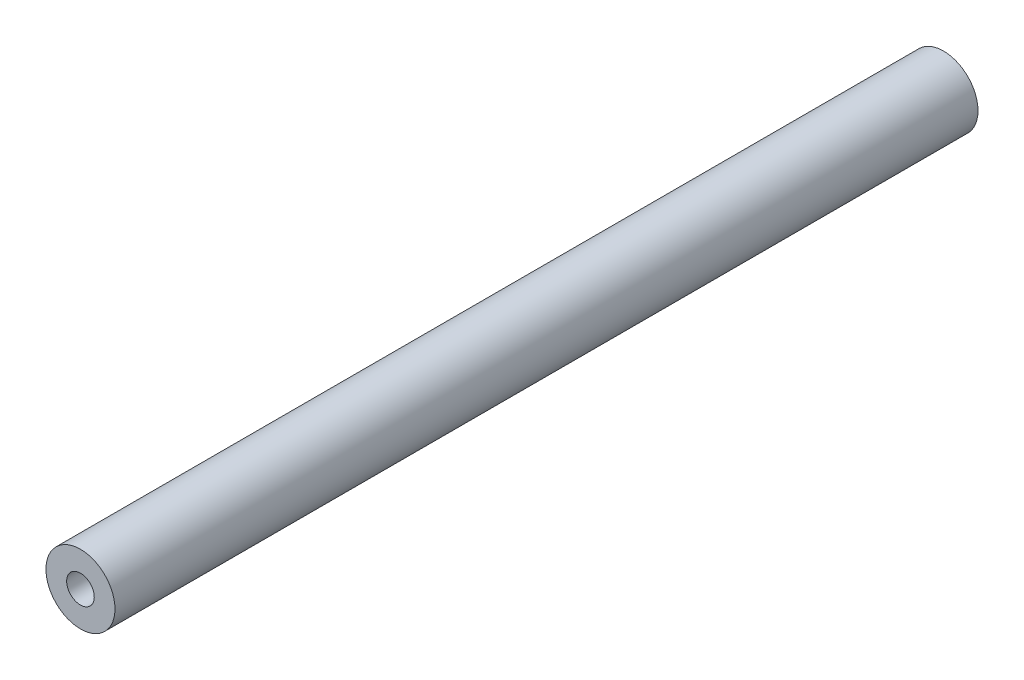
ISO-10303-21;
HEADER;
FILE_DESCRIPTION(('STEP AP214'),'2;1');
FILE_NAME('part.step','',(''),(''),'','','');
FILE_SCHEMA(('AUTOMOTIVE_DESIGN { 1 0 10303 214 1 1 1 1 }'));
ENDSEC;
DATA;
#1=APPLICATION_CONTEXT('core data for automotive mechanical design processes');
#2=APPLICATION_PROTOCOL_DEFINITION('international standard','automotive_design',2000,#1);
#3=PRODUCT_CONTEXT('',#1,'mechanical');
#4=PRODUCT('Part','Part','',(#3));
#5=PRODUCT_RELATED_PRODUCT_CATEGORY('part','',(#4));
#6=PRODUCT_DEFINITION_FORMATION('','',#4);
#7=PRODUCT_DEFINITION_CONTEXT('part definition',#1,'design');
#8=PRODUCT_DEFINITION('design','',#6,#7);
#9=PRODUCT_DEFINITION_SHAPE('','',#8);
#10=(LENGTH_UNIT() NAMED_UNIT(*) SI_UNIT(.MILLI.,.METRE.));
#11=(NAMED_UNIT(*) PLANE_ANGLE_UNIT() SI_UNIT($,.RADIAN.));
#12=(NAMED_UNIT(*) SI_UNIT($,.STERADIAN.) SOLID_ANGLE_UNIT());
#13=UNCERTAINTY_MEASURE_WITH_UNIT(LENGTH_MEASURE(1.E-05),#10,'distance_accuracy_value','');
#14=(GEOMETRIC_REPRESENTATION_CONTEXT(3) GLOBAL_UNCERTAINTY_ASSIGNED_CONTEXT((#13)) GLOBAL_UNIT_ASSIGNED_CONTEXT((#10,
#11,#12)) REPRESENTATION_CONTEXT('',''));
#15=CARTESIAN_POINT('',(0.,0.,0.));
#16=DIRECTION('',(0.,0.,1.));
#17=DIRECTION('',(1.,0.,0.));
#18=AXIS2_PLACEMENT_3D('',#15,#16,#17);
#19=CARTESIAN_POINT('',(0.,0.,100.));
#20=DIRECTION('',(0.,0.,1.));
#21=DIRECTION('',(1.,0.,0.));
#22=AXIS2_PLACEMENT_3D('',#19,#20,#21);
#23=PLANE('',#22);
#24=CARTESIAN_POINT('',(0.,0.,100.));
#25=DIRECTION('',(0.,0.,1.));
#26=DIRECTION('',(1.,0.,0.));
#27=AXIS2_PLACEMENT_3D('',#24,#25,#26);
#28=CIRCLE('',#27,4.);
#29=CARTESIAN_POINT('',(4.,0.,100.));
#30=VERTEX_POINT('',#29);
#31=EDGE_CURVE('E10',#30,#30,#28,.T.);
#32=ORIENTED_EDGE('',*,*,#31,.T.);
#33=EDGE_LOOP('',(#32));
#34=FACE_BOUND('',#33,.T.);
#35=CARTESIAN_POINT('',(0.,0.,100.));
#36=DIRECTION('',(0.,0.,1.));
#37=DIRECTION('',(1.,0.,0.));
#38=AXIS2_PLACEMENT_3D('',#35,#36,#37);
#39=CIRCLE('',#38,1.6);
#40=CARTESIAN_POINT('',(1.6,0.,100.));
#41=VERTEX_POINT('',#40);
#42=EDGE_CURVE('E48',#41,#41,#39,.T.);
#43=ORIENTED_EDGE('',*,*,#42,.F.);
#44=EDGE_LOOP('',(#43));
#45=FACE_BOUND('',#44,.T.);
#46=ADVANCED_FACE('F37',(#34,#45),#23,.T.);
#47=CARTESIAN_POINT('',(0.,0.,0.));
#48=DIRECTION('',(0.,0.,1.));
#49=DIRECTION('',(1.,0.,0.));
#50=AXIS2_PLACEMENT_3D('',#47,#48,#49);
#51=PLANE('',#50);
#52=CARTESIAN_POINT('',(0.,0.,0.));
#53=DIRECTION('',(0.,0.,1.));
#54=DIRECTION('',(1.,0.,0.));
#55=AXIS2_PLACEMENT_3D('',#52,#53,#54);
#56=CIRCLE('',#55,4.);
#57=CARTESIAN_POINT('',(4.,0.,0.));
#58=VERTEX_POINT('',#57);
#59=EDGE_CURVE('E41',#58,#58,#56,.T.);
#60=ORIENTED_EDGE('',*,*,#59,.F.);
#61=EDGE_LOOP('',(#60));
#62=FACE_BOUND('',#61,.T.);
#63=CARTESIAN_POINT('',(0.,0.,0.));
#64=DIRECTION('',(0.,0.,1.));
#65=DIRECTION('',(1.,0.,0.));
#66=AXIS2_PLACEMENT_3D('',#63,#64,#65);
#67=CIRCLE('',#66,1.6);
#68=CARTESIAN_POINT('',(1.6,0.,0.));
#69=VERTEX_POINT('',#68);
#70=EDGE_CURVE('E50',#69,#69,#67,.T.);
#71=ORIENTED_EDGE('',*,*,#70,.T.);
#72=EDGE_LOOP('',(#71));
#73=FACE_BOUND('',#72,.T.);
#74=ADVANCED_FACE('F60',(#62,#73),#51,.F.);
#75=CARTESIAN_POINT('',(0.,0.,100.));
#76=DIRECTION('',(0.,0.,-1.));
#77=DIRECTION('',(-1.,0.,0.));
#78=AXIS2_PLACEMENT_3D('',#75,#76,#77);
#79=CYLINDRICAL_SURFACE('',#78,4.);
#80=ORIENTED_EDGE('',*,*,#31,.F.);
#81=EDGE_LOOP('',(#80));
#82=FACE_BOUND('',#81,.T.);
#83=ORIENTED_EDGE('',*,*,#59,.T.);
#84=EDGE_LOOP('',(#83));
#85=FACE_BOUND('',#84,.T.);
#86=ADVANCED_FACE('F39',(#82,#85),#79,.T.);
#87=CARTESIAN_POINT('',(0.,0.,100.));
#88=DIRECTION('',(0.,0.,-1.));
#89=DIRECTION('',(-1.,0.,0.));
#90=AXIS2_PLACEMENT_3D('',#87,#88,#89);
#91=CYLINDRICAL_SURFACE('',#90,1.6);
#92=ORIENTED_EDGE('',*,*,#42,.T.);
#93=EDGE_LOOP('',(#92));
#94=FACE_BOUND('',#93,.T.);
#95=ORIENTED_EDGE('',*,*,#70,.F.);
#96=EDGE_LOOP('',(#95));
#97=FACE_BOUND('',#96,.T.);
#98=ADVANCED_FACE('F56',(#94,#97),#91,.F.);
#99=CLOSED_SHELL('',(#46,#74,#86,#98));
#100=MANIFOLD_SOLID_BREP('B2',#99);
#101=ADVANCED_BREP_SHAPE_REPRESENTATION('',(#18,#100),#14);
#102=SHAPE_DEFINITION_REPRESENTATION(#9,#101);
ENDSEC;
END-ISO-10303-21;
